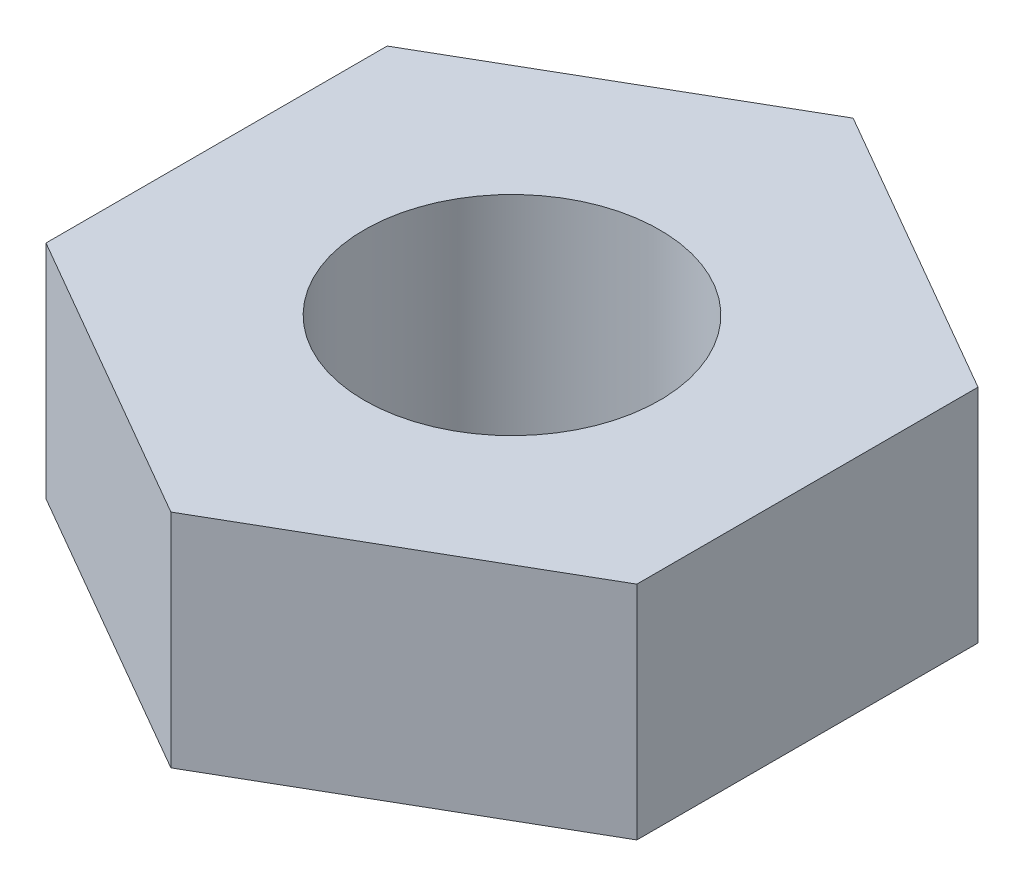
ISO-10303-21;
HEADER;
FILE_DESCRIPTION(('STEP AP214'),'2;1');
FILE_NAME('part.step','',(''),(''),'','','');
FILE_SCHEMA(('AUTOMOTIVE_DESIGN { 1 0 10303 214 1 1 1 1 }'));
ENDSEC;
DATA;
#1=APPLICATION_CONTEXT('core data for automotive mechanical design processes');
#2=APPLICATION_PROTOCOL_DEFINITION('international standard','automotive_design',2000,#1);
#3=PRODUCT_CONTEXT('',#1,'mechanical');
#4=PRODUCT('Part','Part','',(#3));
#5=PRODUCT_RELATED_PRODUCT_CATEGORY('part','',(#4));
#6=PRODUCT_DEFINITION_FORMATION('','',#4);
#7=PRODUCT_DEFINITION_CONTEXT('part definition',#1,'design');
#8=PRODUCT_DEFINITION('design','',#6,#7);
#9=PRODUCT_DEFINITION_SHAPE('','',#8);
#10=(LENGTH_UNIT() NAMED_UNIT(*) SI_UNIT(.MILLI.,.METRE.));
#11=(NAMED_UNIT(*) PLANE_ANGLE_UNIT() SI_UNIT($,.RADIAN.));
#12=(NAMED_UNIT(*) SI_UNIT($,.STERADIAN.) SOLID_ANGLE_UNIT());
#13=UNCERTAINTY_MEASURE_WITH_UNIT(LENGTH_MEASURE(1.E-05),#10,'distance_accuracy_value','');
#14=(GEOMETRIC_REPRESENTATION_CONTEXT(3) GLOBAL_UNCERTAINTY_ASSIGNED_CONTEXT((#13)) GLOBAL_UNIT_ASSIGNED_CONTEXT((#10,
#11,#12)) REPRESENTATION_CONTEXT('',''));
#15=CARTESIAN_POINT('',(0.,0.,0.));
#16=DIRECTION('',(0.,0.,1.));
#17=DIRECTION('',(1.,0.,0.));
#18=AXIS2_PLACEMENT_3D('',#15,#16,#17);
#19=CARTESIAN_POINT('',(0.,1.5,0.));
#20=DIRECTION('',(0.,1.,0.));
#21=DIRECTION('',(0.,0.,1.));
#22=AXIS2_PLACEMENT_3D('',#19,#20,#21);
#23=PLANE('',#22);
#24=DIRECTION('',(-0.866025403784439,0.,-0.5));
#25=VECTOR('',#24,1.);
#26=CARTESIAN_POINT('',(2.,1.5,-1.15470053837925));
#27=LINE('',#26,#25);
#28=CARTESIAN_POINT('',(2.,1.5,-1.15470053837925));
#29=VERTEX_POINT('',#28);
#30=CARTESIAN_POINT('',(0.,1.5,-2.3094010767585));
#31=VERTEX_POINT('',#30);
#32=EDGE_CURVE('E149',#29,#31,#27,.T.);
#33=ORIENTED_EDGE('',*,*,#32,.T.);
#34=DIRECTION('',(-0.866025403784439,0.,0.5));
#35=VECTOR('',#34,1.);
#36=CARTESIAN_POINT('',(0.,1.5,-2.3094010767585));
#37=LINE('',#36,#35);
#38=CARTESIAN_POINT('',(-2.,1.5,-1.15470053837925));
#39=VERTEX_POINT('',#38);
#40=EDGE_CURVE('E97',#31,#39,#37,.T.);
#41=ORIENTED_EDGE('',*,*,#40,.T.);
#42=DIRECTION('',(0.,0.,1.));
#43=VECTOR('',#42,1.);
#44=CARTESIAN_POINT('',(-2.,1.5,-1.15470053837925));
#45=LINE('',#44,#43);
#46=CARTESIAN_POINT('',(-2.,1.5,1.15470053837925));
#47=VERTEX_POINT('',#46);
#48=EDGE_CURVE('E110',#39,#47,#45,.T.);
#49=ORIENTED_EDGE('',*,*,#48,.T.);
#50=DIRECTION('',(0.866025403784439,0.,0.5));
#51=VECTOR('',#50,1.);
#52=CARTESIAN_POINT('',(-2.,1.5,1.15470053837925));
#53=LINE('',#52,#51);
#54=CARTESIAN_POINT('',(0.,1.5,2.3094010767585));
#55=VERTEX_POINT('',#54);
#56=EDGE_CURVE('E104',#47,#55,#53,.T.);
#57=ORIENTED_EDGE('',*,*,#56,.T.);
#58=DIRECTION('',(0.866025403784439,0.,-0.5));
#59=VECTOR('',#58,1.);
#60=CARTESIAN_POINT('',(0.,1.5,2.3094010767585));
#61=LINE('',#60,#59);
#62=CARTESIAN_POINT('',(2.,1.5,1.15470053837925));
#63=VERTEX_POINT('',#62);
#64=EDGE_CURVE('E108',#55,#63,#61,.T.);
#65=ORIENTED_EDGE('',*,*,#64,.T.);
#66=DIRECTION('',(0.,0.,-1.));
#67=VECTOR('',#66,1.);
#68=CARTESIAN_POINT('',(2.,1.5,1.15470053837925));
#69=LINE('',#68,#67);
#70=EDGE_CURVE('E60',#63,#29,#69,.T.);
#71=ORIENTED_EDGE('',*,*,#70,.T.);
#72=EDGE_LOOP('',(#33,#41,#49,#57,#65,#71));
#73=FACE_BOUND('',#72,.T.);
#74=CARTESIAN_POINT('',(0.,1.5,0.));
#75=DIRECTION('',(0.,1.,0.));
#76=DIRECTION('',(0.,0.,1.));
#77=AXIS2_PLACEMENT_3D('',#74,#75,#76);
#78=CIRCLE('',#77,1.);
#79=CARTESIAN_POINT('',(0.,1.5,1.));
#80=VERTEX_POINT('',#79);
#81=EDGE_CURVE('E137',#80,#80,#78,.T.);
#82=ORIENTED_EDGE('',*,*,#81,.F.);
#83=EDGE_LOOP('',(#82));
#84=FACE_BOUND('',#83,.T.);
#85=ADVANCED_FACE('F42',(#73,#84),#23,.T.);
#86=CARTESIAN_POINT('',(0.,0.,0.));
#87=DIRECTION('',(0.,1.,0.));
#88=DIRECTION('',(0.,0.,1.));
#89=AXIS2_PLACEMENT_3D('',#86,#87,#88);
#90=PLANE('',#89);
#91=DIRECTION('',(-0.866025403784439,0.,-0.5));
#92=VECTOR('',#91,1.);
#93=CARTESIAN_POINT('',(2.,0.,-1.15470053837925));
#94=LINE('',#93,#92);
#95=CARTESIAN_POINT('',(2.,0.,-1.15470053837925));
#96=VERTEX_POINT('',#95);
#97=CARTESIAN_POINT('',(0.,0.,-2.3094010767585));
#98=VERTEX_POINT('',#97);
#99=EDGE_CURVE('E132',#96,#98,#94,.T.);
#100=ORIENTED_EDGE('',*,*,#99,.F.);
#101=DIRECTION('',(0.,0.,-1.));
#102=VECTOR('',#101,1.);
#103=CARTESIAN_POINT('',(2.,0.,1.15470053837925));
#104=LINE('',#103,#102);
#105=CARTESIAN_POINT('',(2.,0.,1.15470053837925));
#106=VERTEX_POINT('',#105);
#107=EDGE_CURVE('E89',#106,#96,#104,.T.);
#108=ORIENTED_EDGE('',*,*,#107,.F.);
#109=DIRECTION('',(0.866025403784439,0.,-0.5));
#110=VECTOR('',#109,1.);
#111=CARTESIAN_POINT('',(0.,0.,2.3094010767585));
#112=LINE('',#111,#110);
#113=CARTESIAN_POINT('',(0.,0.,2.3094010767585));
#114=VERTEX_POINT('',#113);
#115=EDGE_CURVE('E83',#114,#106,#112,.T.);
#116=ORIENTED_EDGE('',*,*,#115,.F.);
#117=DIRECTION('',(0.866025403784439,0.,0.5));
#118=VECTOR('',#117,1.);
#119=CARTESIAN_POINT('',(-2.,0.,1.15470053837925));
#120=LINE('',#119,#118);
#121=CARTESIAN_POINT('',(-2.,0.,1.15470053837925));
#122=VERTEX_POINT('',#121);
#123=EDGE_CURVE('E119',#122,#114,#120,.T.);
#124=ORIENTED_EDGE('',*,*,#123,.F.);
#125=DIRECTION('',(0.,0.,1.));
#126=VECTOR('',#125,1.);
#127=CARTESIAN_POINT('',(-2.,0.,-1.15470053837925));
#128=LINE('',#127,#126);
#129=CARTESIAN_POINT('',(-2.,0.,-1.15470053837925));
#130=VERTEX_POINT('',#129);
#131=EDGE_CURVE('E140',#130,#122,#128,.T.);
#132=ORIENTED_EDGE('',*,*,#131,.F.);
#133=DIRECTION('',(-0.866025403784439,0.,0.5));
#134=VECTOR('',#133,1.);
#135=CARTESIAN_POINT('',(0.,0.,-2.3094010767585));
#136=LINE('',#135,#134);
#137=EDGE_CURVE('E136',#98,#130,#136,.T.);
#138=ORIENTED_EDGE('',*,*,#137,.F.);
#139=EDGE_LOOP('',(#100,#108,#116,#124,#132,#138));
#140=FACE_BOUND('',#139,.T.);
#141=CARTESIAN_POINT('',(0.,0.,0.));
#142=DIRECTION('',(0.,1.,0.));
#143=DIRECTION('',(0.,0.,1.));
#144=AXIS2_PLACEMENT_3D('',#141,#142,#143);
#145=CIRCLE('',#144,1.);
#146=CARTESIAN_POINT('',(0.,0.,1.));
#147=VERTEX_POINT('',#146);
#148=EDGE_CURVE('E248',#147,#147,#145,.T.);
#149=ORIENTED_EDGE('',*,*,#148,.T.);
#150=EDGE_LOOP('',(#149));
#151=FACE_BOUND('',#150,.T.);
#152=ADVANCED_FACE('F162',(#140,#151),#90,.F.);
#153=CARTESIAN_POINT('',(2.,1.5,-1.15470053837925));
#154=DIRECTION('',(-0.5,0.,0.866025403784439));
#155=DIRECTION('',(0.866025403784439,0.,0.5));
#156=AXIS2_PLACEMENT_3D('',#153,#154,#155);
#157=PLANE('',#156);
#158=ORIENTED_EDGE('',*,*,#99,.T.);
#159=DIRECTION('',(0.,-1.,0.));
#160=VECTOR('',#159,1.);
#161=CARTESIAN_POINT('',(0.,1.5,-2.3094010767585));
#162=LINE('',#161,#160);
#163=EDGE_CURVE('E11',#31,#98,#162,.T.);
#164=ORIENTED_EDGE('',*,*,#163,.F.);
#165=ORIENTED_EDGE('',*,*,#32,.F.);
#166=DIRECTION('',(0.,-1.,0.));
#167=VECTOR('',#166,1.);
#168=CARTESIAN_POINT('',(2.,1.5,-1.15470053837925));
#169=LINE('',#168,#167);
#170=EDGE_CURVE('E128',#29,#96,#169,.T.);
#171=ORIENTED_EDGE('',*,*,#170,.T.);
#172=EDGE_LOOP('',(#158,#164,#165,#171));
#173=FACE_BOUND('',#172,.T.);
#174=ADVANCED_FACE('F44',(#173),#157,.F.);
#175=CARTESIAN_POINT('',(0.,1.5,-2.3094010767585));
#176=DIRECTION('',(0.5,0.,0.866025403784438));
#177=DIRECTION('',(0.866025403784439,0.,-0.5));
#178=AXIS2_PLACEMENT_3D('',#175,#176,#177);
#179=PLANE('',#178);
#180=ORIENTED_EDGE('',*,*,#137,.T.);
#181=DIRECTION('',(0.,-1.,0.));
#182=VECTOR('',#181,1.);
#183=CARTESIAN_POINT('',(-2.,1.5,-1.15470053837925));
#184=LINE('',#183,#182);
#185=EDGE_CURVE('E52',#39,#130,#184,.T.);
#186=ORIENTED_EDGE('',*,*,#185,.F.);
#187=ORIENTED_EDGE('',*,*,#40,.F.);
#188=ORIENTED_EDGE('',*,*,#163,.T.);
#189=EDGE_LOOP('',(#180,#186,#187,#188));
#190=FACE_BOUND('',#189,.T.);
#191=ADVANCED_FACE('F187',(#190),#179,.F.);
#192=CARTESIAN_POINT('',(-2.,1.5,-1.15470053837925));
#193=DIRECTION('',(1.,0.,0.));
#194=DIRECTION('',(0.,0.,-1.));
#195=AXIS2_PLACEMENT_3D('',#192,#193,#194);
#196=PLANE('',#195);
#197=ORIENTED_EDGE('',*,*,#131,.T.);
#198=DIRECTION('',(0.,-1.,0.));
#199=VECTOR('',#198,1.);
#200=CARTESIAN_POINT('',(-2.,1.5,1.15470053837925));
#201=LINE('',#200,#199);
#202=EDGE_CURVE('E121',#47,#122,#201,.T.);
#203=ORIENTED_EDGE('',*,*,#202,.F.);
#204=ORIENTED_EDGE('',*,*,#48,.F.);
#205=ORIENTED_EDGE('',*,*,#185,.T.);
#206=EDGE_LOOP('',(#197,#203,#204,#205));
#207=FACE_BOUND('',#206,.T.);
#208=ADVANCED_FACE('F159',(#207),#196,.F.);
#209=CARTESIAN_POINT('',(-2.,1.5,1.15470053837925));
#210=DIRECTION('',(0.5,0.,-0.866025403784439));
#211=DIRECTION('',(-0.866025403784439,0.,-0.5));
#212=AXIS2_PLACEMENT_3D('',#209,#210,#211);
#213=PLANE('',#212);
#214=ORIENTED_EDGE('',*,*,#123,.T.);
#215=DIRECTION('',(0.,-1.,0.));
#216=VECTOR('',#215,1.);
#217=CARTESIAN_POINT('',(0.,1.5,2.3094010767585));
#218=LINE('',#217,#216);
#219=EDGE_CURVE('E116',#55,#114,#218,.T.);
#220=ORIENTED_EDGE('',*,*,#219,.F.);
#221=ORIENTED_EDGE('',*,*,#56,.F.);
#222=ORIENTED_EDGE('',*,*,#202,.T.);
#223=EDGE_LOOP('',(#214,#220,#221,#222));
#224=FACE_BOUND('',#223,.T.);
#225=ADVANCED_FACE('F117',(#224),#213,.F.);
#226=CARTESIAN_POINT('',(0.,1.5,2.3094010767585));
#227=DIRECTION('',(-0.5,0.,-0.866025403784439));
#228=DIRECTION('',(-0.866025403784439,0.,0.5));
#229=AXIS2_PLACEMENT_3D('',#226,#227,#228);
#230=PLANE('',#229);
#231=ORIENTED_EDGE('',*,*,#115,.T.);
#232=DIRECTION('',(0.,-1.,0.));
#233=VECTOR('',#232,1.);
#234=CARTESIAN_POINT('',(2.,1.5,1.15470053837925));
#235=LINE('',#234,#233);
#236=EDGE_CURVE('E122',#63,#106,#235,.T.);
#237=ORIENTED_EDGE('',*,*,#236,.F.);
#238=ORIENTED_EDGE('',*,*,#64,.F.);
#239=ORIENTED_EDGE('',*,*,#219,.T.);
#240=EDGE_LOOP('',(#231,#237,#238,#239));
#241=FACE_BOUND('',#240,.T.);
#242=ADVANCED_FACE('F124',(#241),#230,.F.);
#243=CARTESIAN_POINT('',(2.,1.5,1.15470053837925));
#244=DIRECTION('',(-1.,0.,0.));
#245=DIRECTION('',(0.,0.,1.));
#246=AXIS2_PLACEMENT_3D('',#243,#244,#245);
#247=PLANE('',#246);
#248=ORIENTED_EDGE('',*,*,#107,.T.);
#249=ORIENTED_EDGE('',*,*,#170,.F.);
#250=ORIENTED_EDGE('',*,*,#70,.F.);
#251=ORIENTED_EDGE('',*,*,#236,.T.);
#252=EDGE_LOOP('',(#248,#249,#250,#251));
#253=FACE_BOUND('',#252,.T.);
#254=ADVANCED_FACE('F167',(#253),#247,.F.);
#255=CARTESIAN_POINT('',(0.,1.5,0.));
#256=DIRECTION('',(0.,-1.,0.));
#257=DIRECTION('',(0.,0.,-1.));
#258=AXIS2_PLACEMENT_3D('',#255,#256,#257);
#259=CYLINDRICAL_SURFACE('',#258,1.);
#260=ORIENTED_EDGE('',*,*,#81,.T.);
#261=EDGE_LOOP('',(#260));
#262=FACE_BOUND('',#261,.T.);
#263=ORIENTED_EDGE('',*,*,#148,.F.);
#264=EDGE_LOOP('',(#263));
#265=FACE_BOUND('',#264,.T.);
#266=ADVANCED_FACE('F169',(#262,#265),#259,.F.);
#267=CLOSED_SHELL('',(#85,#152,#174,#191,#208,#225,#242,#254,#266));
#268=MANIFOLD_SOLID_BREP('B2',#267);
#269=ADVANCED_BREP_SHAPE_REPRESENTATION('',(#18,#268),#14);
#270=SHAPE_DEFINITION_REPRESENTATION(#9,#269);
ENDSEC;
END-ISO-10303-21;
